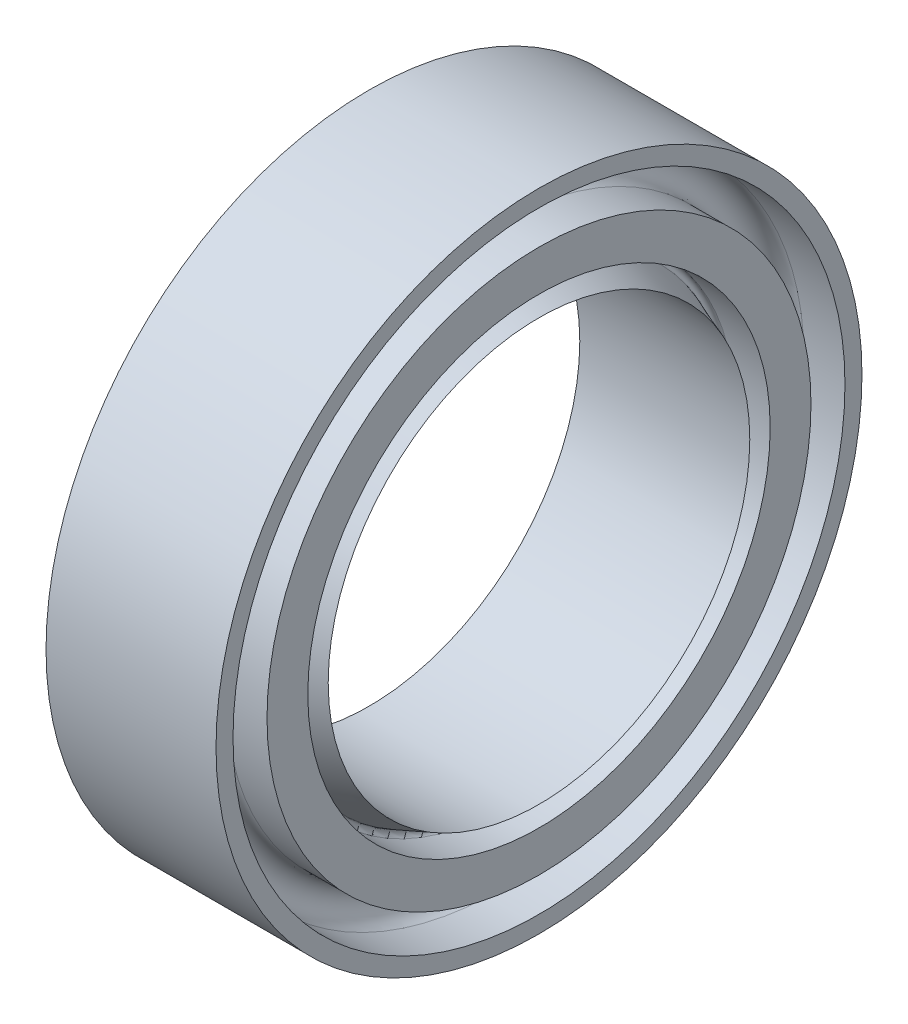
ISO-10303-21;
HEADER;
FILE_DESCRIPTION(('STEP AP214'),'2;1');
FILE_NAME('part.step','',(''),(''),'','','');
FILE_SCHEMA(('AUTOMOTIVE_DESIGN { 1 0 10303 214 1 1 1 1 }'));
ENDSEC;
DATA;
#1=APPLICATION_CONTEXT('core data for automotive mechanical design processes');
#2=APPLICATION_PROTOCOL_DEFINITION('international standard','automotive_design',2000,#1);
#3=PRODUCT_CONTEXT('',#1,'mechanical');
#4=PRODUCT('Part','Part','',(#3));
#5=PRODUCT_RELATED_PRODUCT_CATEGORY('part','',(#4));
#6=PRODUCT_DEFINITION_FORMATION('','',#4);
#7=PRODUCT_DEFINITION_CONTEXT('part definition',#1,'design');
#8=PRODUCT_DEFINITION('design','',#6,#7);
#9=PRODUCT_DEFINITION_SHAPE('','',#8);
#10=(LENGTH_UNIT() NAMED_UNIT(*) SI_UNIT(.MILLI.,.METRE.));
#11=(NAMED_UNIT(*) PLANE_ANGLE_UNIT() SI_UNIT($,.RADIAN.));
#12=(NAMED_UNIT(*) SI_UNIT($,.STERADIAN.) SOLID_ANGLE_UNIT());
#13=UNCERTAINTY_MEASURE_WITH_UNIT(LENGTH_MEASURE(1.E-05),#10,'distance_accuracy_value','');
#14=(GEOMETRIC_REPRESENTATION_CONTEXT(3) GLOBAL_UNCERTAINTY_ASSIGNED_CONTEXT((#13)) GLOBAL_UNIT_ASSIGNED_CONTEXT((#10,
#11,#12)) REPRESENTATION_CONTEXT('',''));
#15=CARTESIAN_POINT('',(0.,0.,0.));
#16=DIRECTION('',(0.,0.,1.));
#17=DIRECTION('',(1.,0.,0.));
#18=AXIS2_PLACEMENT_3D('',#15,#16,#17);
#19=CARTESIAN_POINT('',(5.41822776324123,0.,0.));
#20=DIRECTION('',(1.,0.,0.));
#21=DIRECTION('',(0.,0.,-1.));
#22=AXIS2_PLACEMENT_3D('',#19,#20,#21);
#23=CONICAL_SURFACE('',#22,33.0318354112155,0.358770670270572);
#24=CARTESIAN_POINT('',(0.,0.,0.));
#25=DIRECTION('',(-1.,0.,0.));
#26=DIRECTION('',(0.,0.,1.));
#27=AXIS2_PLACEMENT_3D('',#24,#25,#26);
#28=CIRCLE('',#27,31.);
#29=CARTESIAN_POINT('',(0.,0.,31.));
#30=VERTEX_POINT('',#29);
#31=EDGE_CURVE('E10',#30,#30,#28,.T.);
#32=ORIENTED_EDGE('',*,*,#31,.F.);
#33=EDGE_LOOP('',(#32));
#34=FACE_BOUND('',#33,.T.);
#35=CARTESIAN_POINT('',(5.41822776324123,0.,0.));
#36=DIRECTION('',(-1.,0.,0.));
#37=DIRECTION('',(0.,0.,1.));
#38=AXIS2_PLACEMENT_3D('',#35,#36,#37);
#39=CIRCLE('',#38,33.0318354112155);
#40=CARTESIAN_POINT('',(5.41822776324123,0.,33.0318354112155));
#41=VERTEX_POINT('',#40);
#42=EDGE_CURVE('E91',#41,#41,#39,.T.);
#43=ORIENTED_EDGE('',*,*,#42,.T.);
#44=EDGE_LOOP('',(#43));
#45=FACE_BOUND('',#44,.T.);
#46=ADVANCED_FACE('F31',(#34,#45),#23,.T.);
#47=CARTESIAN_POINT('',(0.,0.,0.));
#48=DIRECTION('',(-1.,0.,0.));
#49=DIRECTION('',(0.,0.,1.));
#50=AXIS2_PLACEMENT_3D('',#47,#48,#49);
#51=CYLINDRICAL_SURFACE('',#50,31.);
#52=CARTESIAN_POINT('',(25.,0.,0.));
#53=DIRECTION('',(-1.,0.,0.));
#54=DIRECTION('',(0.,0.,1.));
#55=AXIS2_PLACEMENT_3D('',#52,#53,#54);
#56=CIRCLE('',#55,31.0000000000001);
#57=CARTESIAN_POINT('',(25.,0.,31.0000000000001));
#58=VERTEX_POINT('',#57);
#59=EDGE_CURVE('E39',#58,#58,#56,.T.);
#60=ORIENTED_EDGE('',*,*,#59,.F.);
#61=EDGE_LOOP('',(#60));
#62=FACE_BOUND('',#61,.T.);
#63=ORIENTED_EDGE('',*,*,#31,.T.);
#64=EDGE_LOOP('',(#63));
#65=FACE_BOUND('',#64,.T.);
#66=ADVANCED_FACE('F187',(#62,#65),#51,.F.);
#67=CARTESIAN_POINT('',(25.,0.,0.));
#68=DIRECTION('',(-1.,0.,0.));
#69=DIRECTION('',(0.,0.,1.));
#70=AXIS2_PLACEMENT_3D('',#67,#68,#69);
#71=CONICAL_SURFACE('',#70,31.0000000000001,0.358770670270573);
#72=CARTESIAN_POINT('',(19.5817722367588,0.,0.));
#73=DIRECTION('',(-1.,0.,0.));
#74=DIRECTION('',(0.,0.,1.));
#75=AXIS2_PLACEMENT_3D('',#72,#73,#74);
#76=CIRCLE('',#75,33.0318354112155);
#77=CARTESIAN_POINT('',(19.5817722367588,0.,33.0318354112155));
#78=VERTEX_POINT('',#77);
#79=EDGE_CURVE('E43',#78,#78,#76,.T.);
#80=ORIENTED_EDGE('',*,*,#79,.F.);
#81=EDGE_LOOP('',(#80));
#82=FACE_BOUND('',#81,.T.);
#83=ORIENTED_EDGE('',*,*,#59,.T.);
#84=EDGE_LOOP('',(#83));
#85=FACE_BOUND('',#84,.T.);
#86=ADVANCED_FACE('F183',(#82,#85),#71,.T.);
#87=CARTESIAN_POINT('',(19.7573339575529,0.,0.));
#88=DIRECTION('',(-1.,0.,0.));
#89=DIRECTION('',(0.,0.,1.));
#90=AXIS2_PLACEMENT_3D('',#87,#88,#89);
#91=TOROIDAL_SURFACE('',#90,33.5000000000001,0.5);
#92=CARTESIAN_POINT('',(19.757333957553,0.,0.));
#93=DIRECTION('',(-1.,0.,0.));
#94=DIRECTION('',(0.,0.,1.));
#95=AXIS2_PLACEMENT_3D('',#92,#93,#94);
#96=CIRCLE('',#95,34.0000000000001);
#97=CARTESIAN_POINT('',(19.757333957553,0.,34.0000000000001));
#98=VERTEX_POINT('',#97);
#99=EDGE_CURVE('E50',#98,#98,#96,.T.);
#100=ORIENTED_EDGE('',*,*,#99,.F.);
#101=EDGE_LOOP('',(#100));
#102=FACE_BOUND('',#101,.T.);
#103=ORIENTED_EDGE('',*,*,#79,.T.);
#104=EDGE_LOOP('',(#103));
#105=FACE_BOUND('',#104,.T.);
#106=ADVANCED_FACE('F180',(#102,#105),#91,.F.);
#107=CARTESIAN_POINT('',(0.,0.,0.));
#108=DIRECTION('',(-1.,0.,0.));
#109=DIRECTION('',(0.,0.,1.));
#110=AXIS2_PLACEMENT_3D('',#107,#108,#109);
#111=CYLINDRICAL_SURFACE('',#110,34.0000000000001);
#112=CARTESIAN_POINT('',(25.,0.,0.));
#113=DIRECTION('',(-1.,0.,0.));
#114=DIRECTION('',(0.,0.,1.));
#115=AXIS2_PLACEMENT_3D('',#112,#113,#114);
#116=CIRCLE('',#115,34.0000000000001);
#117=CARTESIAN_POINT('',(25.,0.,34.0000000000001));
#118=VERTEX_POINT('',#117);
#119=EDGE_CURVE('E55',#118,#118,#116,.T.);
#120=ORIENTED_EDGE('',*,*,#119,.F.);
#121=EDGE_LOOP('',(#120));
#122=FACE_BOUND('',#121,.T.);
#123=ORIENTED_EDGE('',*,*,#99,.T.);
#124=EDGE_LOOP('',(#123));
#125=FACE_BOUND('',#124,.T.);
#126=ADVANCED_FACE('F173',(#122,#125),#111,.F.);
#127=CARTESIAN_POINT('',(25.,40.,0.));
#128=DIRECTION('',(-1.,0.,0.));
#129=DIRECTION('',(0.,0.,1.));
#130=AXIS2_PLACEMENT_3D('',#127,#128,#129);
#131=PLANE('',#130);
#132=CARTESIAN_POINT('',(25.,0.,0.));
#133=DIRECTION('',(-1.,0.,0.));
#134=DIRECTION('',(0.,0.,1.));
#135=AXIS2_PLACEMENT_3D('',#132,#133,#134);
#136=CIRCLE('',#135,40.);
#137=CARTESIAN_POINT('',(25.,0.,40.));
#138=VERTEX_POINT('',#137);
#139=EDGE_CURVE('E54',#138,#138,#136,.T.);
#140=ORIENTED_EDGE('',*,*,#139,.F.);
#141=EDGE_LOOP('',(#140));
#142=FACE_BOUND('',#141,.T.);
#143=ORIENTED_EDGE('',*,*,#119,.T.);
#144=EDGE_LOOP('',(#143));
#145=FACE_BOUND('',#144,.T.);
#146=ADVANCED_FACE('F162',(#142,#145),#131,.F.);
#147=CARTESIAN_POINT('',(0.,0.,0.));
#148=DIRECTION('',(-1.,0.,0.));
#149=DIRECTION('',(0.,0.,1.));
#150=AXIS2_PLACEMENT_3D('',#147,#148,#149);
#151=CYLINDRICAL_SURFACE('',#150,40.);
#152=CARTESIAN_POINT('',(19.,0.,0.));
#153=DIRECTION('',(-1.,0.,0.));
#154=DIRECTION('',(0.,0.,1.));
#155=AXIS2_PLACEMENT_3D('',#152,#153,#154);
#156=CIRCLE('',#155,40.);
#157=CARTESIAN_POINT('',(19.,0.,40.));
#158=VERTEX_POINT('',#157);
#159=EDGE_CURVE('E59',#158,#158,#156,.T.);
#160=ORIENTED_EDGE('',*,*,#159,.F.);
#161=EDGE_LOOP('',(#160));
#162=FACE_BOUND('',#161,.T.);
#163=ORIENTED_EDGE('',*,*,#139,.T.);
#164=EDGE_LOOP('',(#163));
#165=FACE_BOUND('',#164,.T.);
#166=ADVANCED_FACE('F159',(#162,#165),#151,.T.);
#167=CARTESIAN_POINT('',(19.,0.,0.));
#168=DIRECTION('',(-1.,0.,0.));
#169=DIRECTION('',(0.,0.,1.));
#170=AXIS2_PLACEMENT_3D('',#167,#168,#169);
#171=TOROIDAL_SURFACE('',#170,42.5,2.5);
#172=CARTESIAN_POINT('',(19.,0.,0.));
#173=DIRECTION('',(-1.,0.,0.));
#174=DIRECTION('',(0.,0.,1.));
#175=AXIS2_PLACEMENT_3D('',#172,#173,#174);
#176=CIRCLE('',#175,45.);
#177=CARTESIAN_POINT('',(19.,0.,45.));
#178=VERTEX_POINT('',#177);
#179=EDGE_CURVE('E63',#178,#178,#176,.T.);
#180=ORIENTED_EDGE('',*,*,#179,.F.);
#181=EDGE_LOOP('',(#180));
#182=FACE_BOUND('',#181,.T.);
#183=ORIENTED_EDGE('',*,*,#159,.T.);
#184=EDGE_LOOP('',(#183));
#185=FACE_BOUND('',#184,.T.);
#186=ADVANCED_FACE('F152',(#182,#185),#171,.F.);
#187=CARTESIAN_POINT('',(0.,0.,0.));
#188=DIRECTION('',(-1.,0.,0.));
#189=DIRECTION('',(0.,0.,1.));
#190=AXIS2_PLACEMENT_3D('',#187,#188,#189);
#191=CYLINDRICAL_SURFACE('',#190,45.);
#192=CARTESIAN_POINT('',(25.,0.,0.));
#193=DIRECTION('',(-1.,0.,0.));
#194=DIRECTION('',(0.,0.,1.));
#195=AXIS2_PLACEMENT_3D('',#192,#193,#194);
#196=CIRCLE('',#195,45.);
#197=CARTESIAN_POINT('',(25.,0.,45.));
#198=VERTEX_POINT('',#197);
#199=EDGE_CURVE('E65',#198,#198,#196,.T.);
#200=ORIENTED_EDGE('',*,*,#199,.F.);
#201=EDGE_LOOP('',(#200));
#202=FACE_BOUND('',#201,.T.);
#203=ORIENTED_EDGE('',*,*,#179,.T.);
#204=EDGE_LOOP('',(#203));
#205=FACE_BOUND('',#204,.T.);
#206=ADVANCED_FACE('F150',(#202,#205),#191,.F.);
#207=CARTESIAN_POINT('',(25.,45.,0.));
#208=DIRECTION('',(-1.,0.,0.));
#209=DIRECTION('',(0.,0.,1.));
#210=AXIS2_PLACEMENT_3D('',#207,#208,#209);
#211=PLANE('',#210);
#212=CARTESIAN_POINT('',(25.,0.,0.));
#213=DIRECTION('',(-1.,0.,0.));
#214=DIRECTION('',(0.,0.,1.));
#215=AXIS2_PLACEMENT_3D('',#212,#213,#214);
#216=CIRCLE('',#215,47.5);
#217=CARTESIAN_POINT('',(25.,0.,47.5));
#218=VERTEX_POINT('',#217);
#219=EDGE_CURVE('E70',#218,#218,#216,.T.);
#220=ORIENTED_EDGE('',*,*,#219,.F.);
#221=EDGE_LOOP('',(#220));
#222=FACE_BOUND('',#221,.T.);
#223=ORIENTED_EDGE('',*,*,#199,.T.);
#224=EDGE_LOOP('',(#223));
#225=FACE_BOUND('',#224,.T.);
#226=ADVANCED_FACE('F141',(#222,#225),#211,.F.);
#227=CARTESIAN_POINT('',(0.,0.,0.));
#228=DIRECTION('',(-1.,0.,0.));
#229=DIRECTION('',(0.,0.,1.));
#230=AXIS2_PLACEMENT_3D('',#227,#228,#229);
#231=CYLINDRICAL_SURFACE('',#230,47.5);
#232=CARTESIAN_POINT('',(0.,0.,0.));
#233=DIRECTION('',(-1.,0.,0.));
#234=DIRECTION('',(0.,0.,1.));
#235=AXIS2_PLACEMENT_3D('',#232,#233,#234);
#236=CIRCLE('',#235,47.5);
#237=CARTESIAN_POINT('',(0.,0.,47.5));
#238=VERTEX_POINT('',#237);
#239=EDGE_CURVE('E68',#238,#238,#236,.T.);
#240=ORIENTED_EDGE('',*,*,#239,.F.);
#241=EDGE_LOOP('',(#240));
#242=FACE_BOUND('',#241,.T.);
#243=ORIENTED_EDGE('',*,*,#219,.T.);
#244=EDGE_LOOP('',(#243));
#245=FACE_BOUND('',#244,.T.);
#246=ADVANCED_FACE('F134',(#242,#245),#231,.T.);
#247=CARTESIAN_POINT('',(0.,45.,0.));
#248=DIRECTION('',(1.,0.,0.));
#249=DIRECTION('',(0.,0.,-1.));
#250=AXIS2_PLACEMENT_3D('',#247,#248,#249);
#251=PLANE('',#250);
#252=CARTESIAN_POINT('',(0.,0.,0.));
#253=DIRECTION('',(-1.,0.,0.));
#254=DIRECTION('',(0.,0.,1.));
#255=AXIS2_PLACEMENT_3D('',#252,#253,#254);
#256=CIRCLE('',#255,45.);
#257=CARTESIAN_POINT('',(0.,0.,45.));
#258=VERTEX_POINT('',#257);
#259=EDGE_CURVE('E75',#258,#258,#256,.T.);
#260=ORIENTED_EDGE('',*,*,#259,.F.);
#261=EDGE_LOOP('',(#260));
#262=FACE_BOUND('',#261,.T.);
#263=ORIENTED_EDGE('',*,*,#239,.T.);
#264=EDGE_LOOP('',(#263));
#265=FACE_BOUND('',#264,.T.);
#266=ADVANCED_FACE('F129',(#262,#265),#251,.F.);
#267=CARTESIAN_POINT('',(0.,0.,0.));
#268=DIRECTION('',(-1.,0.,0.));
#269=DIRECTION('',(0.,0.,1.));
#270=AXIS2_PLACEMENT_3D('',#267,#268,#269);
#271=CYLINDRICAL_SURFACE('',#270,45.);
#272=CARTESIAN_POINT('',(6.,0.,0.));
#273=DIRECTION('',(-1.,0.,0.));
#274=DIRECTION('',(0.,0.,1.));
#275=AXIS2_PLACEMENT_3D('',#272,#273,#274);
#276=CIRCLE('',#275,45.);
#277=CARTESIAN_POINT('',(6.,0.,45.));
#278=VERTEX_POINT('',#277);
#279=EDGE_CURVE('E78',#278,#278,#276,.T.);
#280=ORIENTED_EDGE('',*,*,#279,.F.);
#281=EDGE_LOOP('',(#280));
#282=FACE_BOUND('',#281,.T.);
#283=ORIENTED_EDGE('',*,*,#259,.T.);
#284=EDGE_LOOP('',(#283));
#285=FACE_BOUND('',#284,.T.);
#286=ADVANCED_FACE('F121',(#282,#285),#271,.F.);
#287=CARTESIAN_POINT('',(6.,0.,0.));
#288=DIRECTION('',(-1.,0.,0.));
#289=DIRECTION('',(0.,0.,1.));
#290=AXIS2_PLACEMENT_3D('',#287,#288,#289);
#291=TOROIDAL_SURFACE('',#290,42.5,2.5);
#292=CARTESIAN_POINT('',(6.,0.,0.));
#293=DIRECTION('',(-1.,0.,0.));
#294=DIRECTION('',(0.,0.,1.));
#295=AXIS2_PLACEMENT_3D('',#292,#293,#294);
#296=CIRCLE('',#295,40.);
#297=CARTESIAN_POINT('',(6.,0.,40.));
#298=VERTEX_POINT('',#297);
#299=EDGE_CURVE('E80',#298,#298,#296,.T.);
#300=ORIENTED_EDGE('',*,*,#299,.F.);
#301=EDGE_LOOP('',(#300));
#302=FACE_BOUND('',#301,.T.);
#303=ORIENTED_EDGE('',*,*,#279,.T.);
#304=EDGE_LOOP('',(#303));
#305=FACE_BOUND('',#304,.T.);
#306=ADVANCED_FACE('F116',(#302,#305),#291,.F.);
#307=CARTESIAN_POINT('',(0.,0.,0.));
#308=DIRECTION('',(-1.,0.,0.));
#309=DIRECTION('',(0.,0.,1.));
#310=AXIS2_PLACEMENT_3D('',#307,#308,#309);
#311=CYLINDRICAL_SURFACE('',#310,40.);
#312=CARTESIAN_POINT('',(0.,0.,0.));
#313=DIRECTION('',(-1.,0.,0.));
#314=DIRECTION('',(0.,0.,1.));
#315=AXIS2_PLACEMENT_3D('',#312,#313,#314);
#316=CIRCLE('',#315,40.);
#317=CARTESIAN_POINT('',(0.,0.,40.));
#318=VERTEX_POINT('',#317);
#319=EDGE_CURVE('E85',#318,#318,#316,.T.);
#320=ORIENTED_EDGE('',*,*,#319,.F.);
#321=EDGE_LOOP('',(#320));
#322=FACE_BOUND('',#321,.T.);
#323=ORIENTED_EDGE('',*,*,#299,.T.);
#324=EDGE_LOOP('',(#323));
#325=FACE_BOUND('',#324,.T.);
#326=ADVANCED_FACE('F112',(#322,#325),#311,.T.);
#327=CARTESIAN_POINT('',(0.,40.,0.));
#328=DIRECTION('',(1.,0.,0.));
#329=DIRECTION('',(0.,0.,-1.));
#330=AXIS2_PLACEMENT_3D('',#327,#328,#329);
#331=PLANE('',#330);
#332=CARTESIAN_POINT('',(0.,0.,0.));
#333=DIRECTION('',(-1.,0.,0.));
#334=DIRECTION('',(0.,0.,1.));
#335=AXIS2_PLACEMENT_3D('',#332,#333,#334);
#336=CIRCLE('',#335,34.);
#337=CARTESIAN_POINT('',(0.,0.,34.));
#338=VERTEX_POINT('',#337);
#339=EDGE_CURVE('E82',#338,#338,#336,.T.);
#340=ORIENTED_EDGE('',*,*,#339,.F.);
#341=EDGE_LOOP('',(#340));
#342=FACE_BOUND('',#341,.T.);
#343=ORIENTED_EDGE('',*,*,#319,.T.);
#344=EDGE_LOOP('',(#343));
#345=FACE_BOUND('',#344,.T.);
#346=ADVANCED_FACE('F103',(#342,#345),#331,.F.);
#347=CARTESIAN_POINT('',(0.,0.,0.));
#348=DIRECTION('',(-1.,0.,0.));
#349=DIRECTION('',(0.,0.,1.));
#350=AXIS2_PLACEMENT_3D('',#347,#348,#349);
#351=CYLINDRICAL_SURFACE('',#350,34.);
#352=CARTESIAN_POINT('',(5.24266604244703,0.,0.));
#353=DIRECTION('',(-1.,0.,0.));
#354=DIRECTION('',(0.,0.,1.));
#355=AXIS2_PLACEMENT_3D('',#352,#353,#354);
#356=CIRCLE('',#355,34.);
#357=CARTESIAN_POINT('',(5.24266604244703,0.,34.));
#358=VERTEX_POINT('',#357);
#359=EDGE_CURVE('E88',#358,#358,#356,.T.);
#360=ORIENTED_EDGE('',*,*,#359,.F.);
#361=EDGE_LOOP('',(#360));
#362=FACE_BOUND('',#361,.T.);
#363=ORIENTED_EDGE('',*,*,#339,.T.);
#364=EDGE_LOOP('',(#363));
#365=FACE_BOUND('',#364,.T.);
#366=ADVANCED_FACE('F98',(#362,#365),#351,.F.);
#367=CARTESIAN_POINT('',(5.24266604244708,0.,0.));
#368=DIRECTION('',(-1.,0.,0.));
#369=DIRECTION('',(0.,0.,1.));
#370=AXIS2_PLACEMENT_3D('',#367,#368,#369);
#371=TOROIDAL_SURFACE('',#370,33.5,0.500000000000001);
#372=ORIENTED_EDGE('',*,*,#42,.F.);
#373=EDGE_LOOP('',(#372));
#374=FACE_BOUND('',#373,.T.);
#375=ORIENTED_EDGE('',*,*,#359,.T.);
#376=EDGE_LOOP('',(#375));
#377=FACE_BOUND('',#376,.T.);
#378=ADVANCED_FACE('F96',(#374,#377),#371,.F.);
#379=CLOSED_SHELL('',(#46,#66,#86,#106,#126,#146,#166,#186,#206,#226,#246,#266,#286,#306,#326,
#346,#366,#378));
#380=MANIFOLD_SOLID_BREP('B2',#379);
#381=ADVANCED_BREP_SHAPE_REPRESENTATION('',(#18,#380),#14);
#382=SHAPE_DEFINITION_REPRESENTATION(#9,#381);
ENDSEC;
END-ISO-10303-21;
